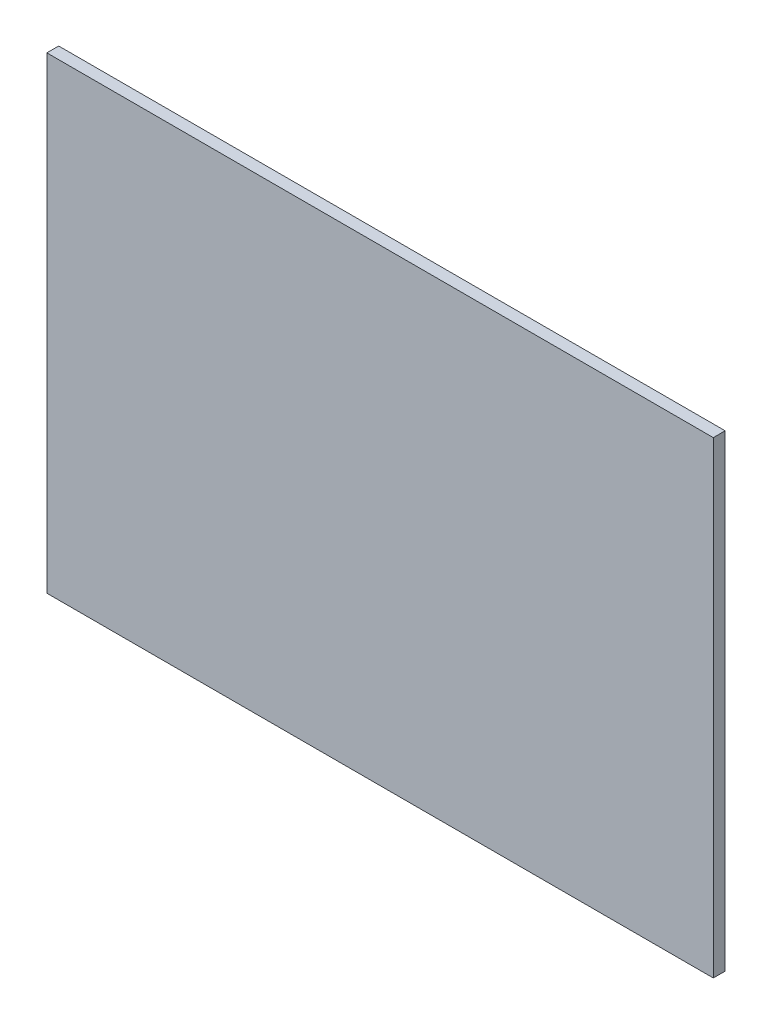
ISO-10303-21;
HEADER;
FILE_DESCRIPTION(('STEP AP214'),'2;1');
FILE_NAME('part.step','',(''),(''),'','','');
FILE_SCHEMA(('AUTOMOTIVE_DESIGN { 1 0 10303 214 1 1 1 1 }'));
ENDSEC;
DATA;
#1=APPLICATION_CONTEXT('core data for automotive mechanical design processes');
#2=APPLICATION_PROTOCOL_DEFINITION('international standard','automotive_design',2000,#1);
#3=PRODUCT_CONTEXT('',#1,'mechanical');
#4=PRODUCT('Part','Part','',(#3));
#5=PRODUCT_RELATED_PRODUCT_CATEGORY('part','',(#4));
#6=PRODUCT_DEFINITION_FORMATION('','',#4);
#7=PRODUCT_DEFINITION_CONTEXT('part definition',#1,'design');
#8=PRODUCT_DEFINITION('design','',#6,#7);
#9=PRODUCT_DEFINITION_SHAPE('','',#8);
#10=(LENGTH_UNIT() NAMED_UNIT(*) SI_UNIT(.MILLI.,.METRE.));
#11=(NAMED_UNIT(*) PLANE_ANGLE_UNIT() SI_UNIT($,.RADIAN.));
#12=(NAMED_UNIT(*) SI_UNIT($,.STERADIAN.) SOLID_ANGLE_UNIT());
#13=UNCERTAINTY_MEASURE_WITH_UNIT(LENGTH_MEASURE(1.E-05),#10,'distance_accuracy_value','');
#14=(GEOMETRIC_REPRESENTATION_CONTEXT(3) GLOBAL_UNCERTAINTY_ASSIGNED_CONTEXT((#13)) GLOBAL_UNIT_ASSIGNED_CONTEXT((#10,
#11,#12)) REPRESENTATION_CONTEXT('',''));
#15=CARTESIAN_POINT('',(0.,0.,0.));
#16=DIRECTION('',(0.,0.,1.));
#17=DIRECTION('',(1.,0.,0.));
#18=AXIS2_PLACEMENT_3D('',#15,#16,#17);
#19=CARTESIAN_POINT('',(0.,-3.20000000000001,3.2));
#20=DIRECTION('',(0.,1.,0.));
#21=DIRECTION('',(0.,0.,1.));
#22=AXIS2_PLACEMENT_3D('',#19,#20,#21);
#23=PLANE('',#22);
#24=DIRECTION('',(1.,0.,0.));
#25=VECTOR('',#24,1.);
#26=CARTESIAN_POINT('',(0.,-3.20000000000001,0.));
#27=LINE('',#26,#25);
#28=CARTESIAN_POINT('',(-157.499999170389,-3.20000000000001,0.));
#29=VERTEX_POINT('',#28);
#30=CARTESIAN_POINT('',(22.5000011482218,-3.20000000000001,0.));
#31=VERTEX_POINT('',#30);
#32=EDGE_CURVE('E97',#29,#31,#27,.T.);
#33=ORIENTED_EDGE('',*,*,#32,.T.);
#34=DIRECTION('',(0.,0.,-1.));
#35=VECTOR('',#34,1.);
#36=CARTESIAN_POINT('',(22.5000011482218,-3.20000000000001,3.2));
#37=LINE('',#36,#35);
#38=CARTESIAN_POINT('',(22.5000011482218,-3.20000000000001,3.2));
#39=VERTEX_POINT('',#38);
#40=EDGE_CURVE('E11',#39,#31,#37,.T.);
#41=ORIENTED_EDGE('',*,*,#40,.F.);
#42=DIRECTION('',(1.,0.,0.));
#43=VECTOR('',#42,1.);
#44=CARTESIAN_POINT('',(0.,-3.20000000000001,3.2));
#45=LINE('',#44,#43);
#46=CARTESIAN_POINT('',(-157.499999170389,-3.20000000000001,3.2));
#47=VERTEX_POINT('',#46);
#48=EDGE_CURVE('E83',#47,#39,#45,.T.);
#49=ORIENTED_EDGE('',*,*,#48,.F.);
#50=DIRECTION('',(0.,0.,-1.));
#51=VECTOR('',#50,1.);
#52=CARTESIAN_POINT('',(-157.499999170389,-3.20000000000001,3.2));
#53=LINE('',#52,#51);
#54=EDGE_CURVE('E50',#47,#29,#53,.T.);
#55=ORIENTED_EDGE('',*,*,#54,.T.);
#56=EDGE_LOOP('',(#33,#41,#49,#55));
#57=FACE_BOUND('',#56,.T.);
#58=ADVANCED_FACE('F34',(#57),#23,.F.);
#59=CARTESIAN_POINT('',(22.5000011482218,0.,3.2));
#60=DIRECTION('',(-1.,0.,0.));
#61=DIRECTION('',(0.,-1.,0.));
#62=AXIS2_PLACEMENT_3D('',#59,#60,#61);
#63=PLANE('',#62);
#64=DIRECTION('',(0.,1.,0.));
#65=VECTOR('',#64,1.);
#66=CARTESIAN_POINT('',(22.5000011482218,0.,0.));
#67=LINE('',#66,#65);
#68=CARTESIAN_POINT('',(22.5000011482218,123.199998713307,0.));
#69=VERTEX_POINT('',#68);
#70=EDGE_CURVE('E88',#31,#69,#67,.T.);
#71=ORIENTED_EDGE('',*,*,#70,.T.);
#72=DIRECTION('',(0.,0.,-1.));
#73=VECTOR('',#72,1.);
#74=CARTESIAN_POINT('',(22.5000011482218,123.199998713307,3.2));
#75=LINE('',#74,#73);
#76=CARTESIAN_POINT('',(22.5000011482218,123.199998713307,3.2));
#77=VERTEX_POINT('',#76);
#78=EDGE_CURVE('E42',#77,#69,#75,.T.);
#79=ORIENTED_EDGE('',*,*,#78,.F.);
#80=DIRECTION('',(0.,1.,0.));
#81=VECTOR('',#80,1.);
#82=CARTESIAN_POINT('',(22.5000011482218,0.,3.2));
#83=LINE('',#82,#81);
#84=EDGE_CURVE('E75',#39,#77,#83,.T.);
#85=ORIENTED_EDGE('',*,*,#84,.F.);
#86=ORIENTED_EDGE('',*,*,#40,.T.);
#87=EDGE_LOOP('',(#71,#79,#85,#86));
#88=FACE_BOUND('',#87,.T.);
#89=ADVANCED_FACE('F87',(#88),#63,.F.);
#90=CARTESIAN_POINT('',(0.,123.199998713307,3.2));
#91=DIRECTION('',(0.,1.,0.));
#92=DIRECTION('',(0.,0.,1.));
#93=AXIS2_PLACEMENT_3D('',#90,#91,#92);
#94=PLANE('',#93);
#95=DIRECTION('',(1.,0.,0.));
#96=VECTOR('',#95,1.);
#97=CARTESIAN_POINT('',(0.,123.199998713307,0.));
#98=LINE('',#97,#96);
#99=CARTESIAN_POINT('',(-157.499999170389,123.199998713307,0.));
#100=VERTEX_POINT('',#99);
#101=EDGE_CURVE('E100',#100,#69,#98,.T.);
#102=ORIENTED_EDGE('',*,*,#101,.F.);
#103=DIRECTION('',(0.,0.,-1.));
#104=VECTOR('',#103,1.);
#105=CARTESIAN_POINT('',(-157.499999170389,123.199998713307,3.2));
#106=LINE('',#105,#104);
#107=CARTESIAN_POINT('',(-157.499999170389,123.199998713307,3.2));
#108=VERTEX_POINT('',#107);
#109=EDGE_CURVE('E64',#108,#100,#106,.T.);
#110=ORIENTED_EDGE('',*,*,#109,.F.);
#111=DIRECTION('',(1.,0.,0.));
#112=VECTOR('',#111,1.);
#113=CARTESIAN_POINT('',(0.,123.199998713307,3.2));
#114=LINE('',#113,#112);
#115=EDGE_CURVE('E82',#108,#77,#114,.T.);
#116=ORIENTED_EDGE('',*,*,#115,.T.);
#117=ORIENTED_EDGE('',*,*,#78,.T.);
#118=EDGE_LOOP('',(#102,#110,#116,#117));
#119=FACE_BOUND('',#118,.T.);
#120=ADVANCED_FACE('F91',(#119),#94,.T.);
#121=CARTESIAN_POINT('',(-157.499999170389,0.,3.2));
#122=DIRECTION('',(-1.,0.,0.));
#123=DIRECTION('',(0.,0.,1.));
#124=AXIS2_PLACEMENT_3D('',#121,#122,#123);
#125=PLANE('',#124);
#126=DIRECTION('',(0.,1.,0.));
#127=VECTOR('',#126,1.);
#128=CARTESIAN_POINT('',(-157.499999170389,0.,0.));
#129=LINE('',#128,#127);
#130=EDGE_CURVE('E102',#29,#100,#129,.T.);
#131=ORIENTED_EDGE('',*,*,#130,.F.);
#132=ORIENTED_EDGE('',*,*,#54,.F.);
#133=DIRECTION('',(0.,1.,0.));
#134=VECTOR('',#133,1.);
#135=CARTESIAN_POINT('',(-157.499999170389,0.,3.2));
#136=LINE('',#135,#134);
#137=EDGE_CURVE('E92',#47,#108,#136,.T.);
#138=ORIENTED_EDGE('',*,*,#137,.T.);
#139=ORIENTED_EDGE('',*,*,#109,.T.);
#140=EDGE_LOOP('',(#131,#132,#138,#139));
#141=FACE_BOUND('',#140,.T.);
#142=ADVANCED_FACE('F108',(#141),#125,.T.);
#143=CARTESIAN_POINT('',(0.,0.,3.2));
#144=DIRECTION('',(0.,0.,1.));
#145=DIRECTION('',(1.,0.,0.));
#146=AXIS2_PLACEMENT_3D('',#143,#144,#145);
#147=PLANE('',#146);
#148=ORIENTED_EDGE('',*,*,#48,.T.);
#149=ORIENTED_EDGE('',*,*,#84,.T.);
#150=ORIENTED_EDGE('',*,*,#115,.F.);
#151=ORIENTED_EDGE('',*,*,#137,.F.);
#152=EDGE_LOOP('',(#148,#149,#150,#151));
#153=FACE_BOUND('',#152,.T.);
#154=ADVANCED_FACE('F79',(#153),#147,.T.);
#155=CARTESIAN_POINT('',(0.,0.,0.));
#156=DIRECTION('',(0.,0.,1.));
#157=DIRECTION('',(1.,0.,0.));
#158=AXIS2_PLACEMENT_3D('',#155,#156,#157);
#159=PLANE('',#158);
#160=ORIENTED_EDGE('',*,*,#32,.F.);
#161=ORIENTED_EDGE('',*,*,#130,.T.);
#162=ORIENTED_EDGE('',*,*,#101,.T.);
#163=ORIENTED_EDGE('',*,*,#70,.F.);
#164=EDGE_LOOP('',(#160,#161,#162,#163));
#165=FACE_BOUND('',#164,.T.);
#166=ADVANCED_FACE('F107',(#165),#159,.F.);
#167=CLOSED_SHELL('',(#58,#89,#120,#142,#154,#166));
#168=MANIFOLD_SOLID_BREP('B2',#167);
#169=ADVANCED_BREP_SHAPE_REPRESENTATION('',(#18,#168),#14);
#170=SHAPE_DEFINITION_REPRESENTATION(#9,#169);
ENDSEC;
END-ISO-10303-21;
